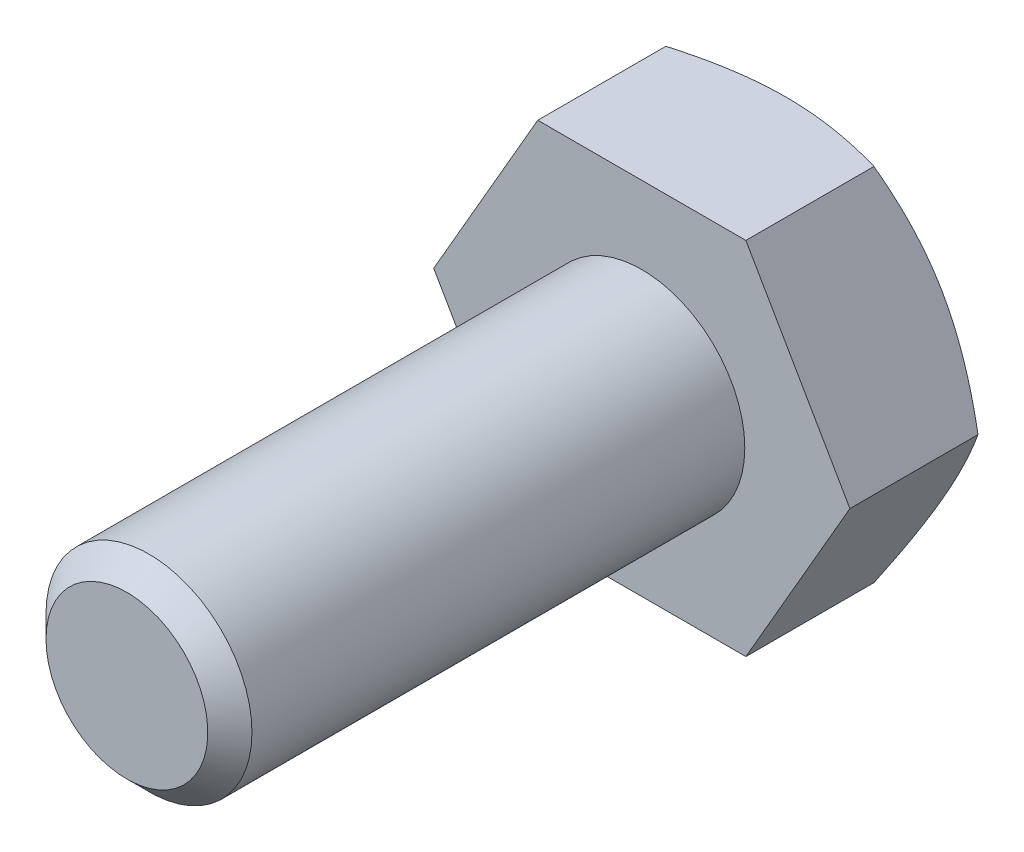
ISO-10303-21;
HEADER;
FILE_DESCRIPTION(('STEP AP214'),'2;1');
FILE_NAME('part.step','',(''),(''),'','','');
FILE_SCHEMA(('AUTOMOTIVE_DESIGN { 1 0 10303 214 1 1 1 1 }'));
ENDSEC;
DATA;
#1=APPLICATION_CONTEXT('core data for automotive mechanical design processes');
#2=APPLICATION_PROTOCOL_DEFINITION('international standard','automotive_design',2000,#1);
#3=PRODUCT_CONTEXT('',#1,'mechanical');
#4=PRODUCT('Part','Part','',(#3));
#5=PRODUCT_RELATED_PRODUCT_CATEGORY('part','',(#4));
#6=PRODUCT_DEFINITION_FORMATION('','',#4);
#7=PRODUCT_DEFINITION_CONTEXT('part definition',#1,'design');
#8=PRODUCT_DEFINITION('design','',#6,#7);
#9=PRODUCT_DEFINITION_SHAPE('','',#8);
#10=(LENGTH_UNIT() NAMED_UNIT(*) SI_UNIT(.MILLI.,.METRE.));
#11=(NAMED_UNIT(*) PLANE_ANGLE_UNIT() SI_UNIT($,.RADIAN.));
#12=(NAMED_UNIT(*) SI_UNIT($,.STERADIAN.) SOLID_ANGLE_UNIT());
#13=UNCERTAINTY_MEASURE_WITH_UNIT(LENGTH_MEASURE(1.E-05),#10,'distance_accuracy_value','');
#14=(GEOMETRIC_REPRESENTATION_CONTEXT(3) GLOBAL_UNCERTAINTY_ASSIGNED_CONTEXT((#13)) GLOBAL_UNIT_ASSIGNED_CONTEXT((#10,
#11,#12)) REPRESENTATION_CONTEXT('',''));
#15=CARTESIAN_POINT('',(0.,0.,0.));
#16=DIRECTION('',(0.,0.,1.));
#17=DIRECTION('',(1.,0.,0.));
#18=AXIS2_PLACEMENT_3D('',#15,#16,#17);
#19=CARTESIAN_POINT('',(2.02072594216369,-3.5,2.8));
#20=DIRECTION('',(-0.866025403784439,0.5,0.));
#21=DIRECTION('',(-0.5,-0.866025403784439,0.));
#22=AXIS2_PLACEMENT_3D('',#19,#20,#21);
#23=PLANE('',#22);
#24=CARTESIAN_POINT('',(4.04156735438122,0.000200000000000556,0.31267406069337));
#25=CARTESIAN_POINT('',(3.9527667384984,-0.153607178452448,0.261385788989978));
#26=CARTESIAN_POINT('',(3.86319960126198,-0.308742010834423,0.214740953816193));
#27=CARTESIAN_POINT('',(3.68251437287562,-0.621698006576781,0.133321875533351));
#28=CARTESIAN_POINT('',(3.59139307116725,-0.779524730787496,0.0985764355845677));
#29=CARTESIAN_POINT('',(3.41027974688034,-1.09322221038013,0.0444900271828465));
#30=CARTESIAN_POINT('',(3.32031559103708,-1.24904469916069,0.0247890862603917));
#31=CARTESIAN_POINT('',(3.13996396008051,-1.56142288720537,0.00127013273726306));
#32=CARTESIAN_POINT('',(3.04957714051106,-1.71797745103423,-0.00256735545442735));
#33=CARTESIAN_POINT('',(2.88068384499777,-2.01050921992099,0.00541530187698509));
#34=CARTESIAN_POINT('',(2.80215208834114,-2.14653021245791,0.0152754340696155));
#35=CARTESIAN_POINT('',(2.64560020969753,-2.41768602028899,0.0465264668994113));
#36=CARTESIAN_POINT('',(2.5675806292065,-2.55281989768468,0.0679280432858044));
#37=CARTESIAN_POINT('',(2.41070596159678,-2.82453479240518,0.12143040788058));
#38=CARTESIAN_POINT('',(2.33187072981464,-2.96108141927833,0.153757994445087));
#39=CARTESIAN_POINT('',(2.17537608630783,-3.2321380929445,0.227128933807991));
#40=CARTESIAN_POINT('',(2.09771466960098,-3.36665161246853,0.268155046569862));
#41=CARTESIAN_POINT('',(2.02061047210985,-3.5002,0.312674060693366));
#42=B_SPLINE_CURVE_WITH_KNOTS('',3,(#24,#25,#26,#27,#28,#29,#30,#31,#32,#33,#34,#35,#36,#37,#38,
#39,#40,#41),.UNSPECIFIED.,.F.,.F.,(4,2,2,2,2,2,2,2,4),(0.,0.554793832886253,1.11092123814984,
1.65328467083219,2.19498204478403,2.6666513085086,3.13875761298267,3.62133612600509,
4.10296698719187),.UNSPECIFIED.);
#43=CARTESIAN_POINT('',(4.04145188432734,0.,0.312607391169621));
#44=VERTEX_POINT('',#43);
#45=CARTESIAN_POINT('',(3.03108891324553,-1.75,0.));
#46=VERTEX_POINT('',#45);
#47=EDGE_CURVE('E132',#44,#46,#42,.T.);
#48=ORIENTED_EDGE('',*,*,#47,.F.);
#49=DIRECTION('',(0.,0.,-1.));
#50=VECTOR('',#49,1.);
#51=CARTESIAN_POINT('',(4.04145188432738,0.,2.8));
#52=LINE('',#51,#50);
#53=CARTESIAN_POINT('',(4.04145188432738,0.,2.8));
#54=VERTEX_POINT('',#53);
#55=EDGE_CURVE('E136',#54,#44,#52,.T.);
#56=ORIENTED_EDGE('',*,*,#55,.F.);
#57=DIRECTION('',(0.5,0.866025403784438,0.));
#58=VECTOR('',#57,1.);
#59=CARTESIAN_POINT('',(2.02072594216369,-3.5,2.8));
#60=LINE('',#59,#58);
#61=CARTESIAN_POINT('',(2.02072594216369,-3.5,2.8));
#62=VERTEX_POINT('',#61);
#63=EDGE_CURVE('E250',#62,#54,#60,.T.);
#64=ORIENTED_EDGE('',*,*,#63,.F.);
#65=DIRECTION('',(0.,0.,-1.));
#66=VECTOR('',#65,1.);
#67=CARTESIAN_POINT('',(2.02072594216369,-3.5,2.8));
#68=LINE('',#67,#66);
#69=CARTESIAN_POINT('',(2.02072594216361,-3.5,0.312607391169622));
#70=VERTEX_POINT('',#69);
#71=EDGE_CURVE('E226',#62,#70,#68,.T.);
#72=ORIENTED_EDGE('',*,*,#71,.T.);
#73=EDGE_CURVE('E189',#46,#70,#42,.T.);
#74=ORIENTED_EDGE('',*,*,#73,.F.);
#75=EDGE_LOOP('',(#48,#56,#64,#72,#74));
#76=FACE_BOUND('',#75,.T.);
#77=ADVANCED_FACE('F40',(#76),#23,.F.);
#78=CARTESIAN_POINT('',(4.04145188432738,0.,2.8));
#79=DIRECTION('',(-0.866025403784438,-0.5,0.));
#80=DIRECTION('',(0.5,-0.866025403784438,0.));
#81=AXIS2_PLACEMENT_3D('',#78,#79,#80);
#82=PLANE('',#81);
#83=CARTESIAN_POINT('',(2.02061047210985,3.5002,0.312674060693371));
#84=CARTESIAN_POINT('',(2.10941108799267,3.34639282154755,0.261385788989981));
#85=CARTESIAN_POINT('',(2.19897822522909,3.19125798916558,0.214740953816193));
#86=CARTESIAN_POINT('',(2.37966345361545,2.87830199342322,0.133321875533346));
#87=CARTESIAN_POINT('',(2.47078475532382,2.7204752692125,0.0985764355845604));
#88=CARTESIAN_POINT('',(2.65189807961073,2.40677778961987,0.0444900271828419));
#89=CARTESIAN_POINT('',(2.74186223545399,2.25095530083931,0.0247890862603924));
#90=CARTESIAN_POINT('',(2.92221386641055,1.93857711279463,0.00127013273726144));
#91=CARTESIAN_POINT('',(3.01260068598001,1.78202254896577,-0.00256735545443642));
#92=CARTESIAN_POINT('',(3.1814939814933,1.48949078007901,0.00541530187697904));
#93=CARTESIAN_POINT('',(3.26002573814993,1.3534697875421,0.0152754340696177));
#94=CARTESIAN_POINT('',(3.41657761679353,1.08231397971101,0.0465264668994189));
#95=CARTESIAN_POINT('',(3.49459719728457,0.94718010231532,0.0679280432858091));
#96=CARTESIAN_POINT('',(3.65147186489429,0.675465207594818,0.12143040788058));
#97=CARTESIAN_POINT('',(3.73030709667644,0.538918580721665,0.153757994445085));
#98=CARTESIAN_POINT('',(3.88680174018324,0.267861907055498,0.227128933807988));
#99=CARTESIAN_POINT('',(3.96446315689009,0.133348387531463,0.26815504656986));
#100=CARTESIAN_POINT('',(4.04156735438122,-0.000199999999999458,0.312674060693366));
#101=B_SPLINE_CURVE_WITH_KNOTS('',3,(#83,#84,#85,#86,#87,#88,#89,#90,#91,#92,#93,#94,#95,#96,
#97,#98,#99,#100),.UNSPECIFIED.,.F.,.F.,(4,2,2,2,2,2,2,2,4),(0.,0.554793832886253,
1.11092123814984,1.65328467083219,2.19498204478403,2.6666513085086,3.13875761298267,
3.62133612600509,4.10296698719187),.UNSPECIFIED.);
#102=CARTESIAN_POINT('',(2.02072594216373,3.49999999999993,0.312607391169621));
#103=VERTEX_POINT('',#102);
#104=CARTESIAN_POINT('',(3.03108891324553,1.75,0.));
#105=VERTEX_POINT('',#104);
#106=EDGE_CURVE('E111',#103,#105,#101,.T.);
#107=ORIENTED_EDGE('',*,*,#106,.F.);
#108=DIRECTION('',(0.,0.,-1.));
#109=VECTOR('',#108,1.);
#110=CARTESIAN_POINT('',(2.02072594216369,3.5,2.8));
#111=LINE('',#110,#109);
#112=CARTESIAN_POINT('',(2.02072594216369,3.5,2.8));
#113=VERTEX_POINT('',#112);
#114=EDGE_CURVE('E235',#113,#103,#111,.T.);
#115=ORIENTED_EDGE('',*,*,#114,.F.);
#116=DIRECTION('',(-0.5,0.866025403784438,0.));
#117=VECTOR('',#116,1.);
#118=CARTESIAN_POINT('',(4.04145188432738,0.,2.8));
#119=LINE('',#118,#117);
#120=EDGE_CURVE('E254',#54,#113,#119,.T.);
#121=ORIENTED_EDGE('',*,*,#120,.F.);
#122=ORIENTED_EDGE('',*,*,#55,.T.);
#123=EDGE_CURVE('E124',#105,#44,#101,.T.);
#124=ORIENTED_EDGE('',*,*,#123,.F.);
#125=EDGE_LOOP('',(#107,#115,#121,#122,#124));
#126=FACE_BOUND('',#125,.T.);
#127=ADVANCED_FACE('F144',(#126),#82,.F.);
#128=CARTESIAN_POINT('',(2.02072594216369,3.5,2.8));
#129=DIRECTION('',(0.,-1.,0.));
#130=DIRECTION('',(1.,0.,0.));
#131=AXIS2_PLACEMENT_3D('',#128,#129,#130);
#132=PLANE('',#131);
#133=CARTESIAN_POINT('',(-5.51155991662166,3.5,1.74876972324081));
#134=CARTESIAN_POINT('',(-5.35795146497442,3.5,1.67392336064348));
#135=CARTESIAN_POINT('',(-5.20399921327066,3.5,1.59977092634845));
#136=CARTESIAN_POINT('',(-4.89522455167778,3.5,1.45324265223557));
#137=CARTESIAN_POINT('',(-4.74040201636207,3.5,1.3808670770114));
#138=CARTESIAN_POINT('',(-4.42894615294238,3.5,1.23793493399993));
#139=CARTESIAN_POINT('',(-4.27230760071021,3.5,1.16738971193148));
#140=CARTESIAN_POINT('',(-3.95781335407224,3.5,1.02907715201445));
#141=CARTESIAN_POINT('',(-3.79995771524289,3.5,0.961309688205789));
#142=CARTESIAN_POINT('',(-3.47741113342678,3.5,0.82704925806826));
#143=CARTESIAN_POINT('',(-3.31266966191409,3.5,0.760677040301392));
#144=CARTESIAN_POINT('',(-2.9812905533435,3.5,0.632756391222601));
#145=CARTESIAN_POINT('',(-2.81465271050396,3.5,0.571208489240969));
#146=CARTESIAN_POINT('',(-2.47950135142084,3.5,0.454490935593626));
#147=CARTESIAN_POINT('',(-2.31099212961239,3.5,0.399309072522241));
#148=CARTESIAN_POINT('',(-1.97155788075463,3.5,0.297038623207362));
#149=CARTESIAN_POINT('',(-1.80063360563483,3.5,0.249947575461079));
#150=CARTESIAN_POINT('',(-1.4572176944235,3.5,0.166312731904447));
#151=CARTESIAN_POINT('',(-1.28474069132431,3.5,0.129709932809734));
#152=CARTESIAN_POINT('',(-0.937557024710312,3.5,0.0690664437906034));
#153=CARTESIAN_POINT('',(-0.762850605780836,3.5,0.0450243877823887));
#154=CARTESIAN_POINT('',(-0.414396255839321,3.5,0.0117307990577643));
#155=CARTESIAN_POINT('',(-0.240667591359059,3.5,0.00228260576824369));
#156=CARTESIAN_POINT('',(0.106974361978118,3.5,-0.00154556657178666));
#157=CARTESIAN_POINT('',(0.280887653519265,3.5,0.00407467653682997));
#158=CARTESIAN_POINT('',(0.573677732069625,3.5,0.0258160056757364));
#159=CARTESIAN_POINT('',(0.692856455403477,3.5,0.038129486522305));
#160=CARTESIAN_POINT('',(0.930390572672186,3.5,0.0691104276210956));
#161=CARTESIAN_POINT('',(1.04874586201749,3.5,0.0877786805228852));
#162=CARTESIAN_POINT('',(1.40238821330867,3.5,0.152339395828355));
#163=CARTESIAN_POINT('',(1.63613518289363,3.5,0.206777964761831));
#164=CARTESIAN_POINT('',(1.98584040996062,3.5,0.301818253779737));
#165=CARTESIAN_POINT('',(2.10359260845123,3.5,0.336200478121239));
#166=CARTESIAN_POINT('',(2.33795453185626,3.5,0.408694226179538));
#167=CARTESIAN_POINT('',(2.45456424794999,3.5,0.446805778664193));
#168=CARTESIAN_POINT('',(2.6866764879922,3.5,0.526133501179599));
#169=CARTESIAN_POINT('',(2.80217931315367,3.5,0.56734879790521));
#170=CARTESIAN_POINT('',(3.03221622488004,3.5,0.652383319257563));
#171=CARTESIAN_POINT('',(3.14675033363067,3.5,0.696202484064569));
#172=CARTESIAN_POINT('',(3.45518824791988,3.5,0.817586420524256));
#173=CARTESIAN_POINT('',(3.6482785865349,3.5,0.897216284270029));
#174=CARTESIAN_POINT('',(4.03246734047176,3.5,1.06116121789353));
#175=CARTESIAN_POINT('',(4.22356553103579,3.5,1.14547680977311));
#176=CARTESIAN_POINT('',(4.60422080385889,3.5,1.31768022516433));
#177=CARTESIAN_POINT('',(4.79377732281038,3.5,1.40556928969842));
#178=CARTESIAN_POINT('',(5.17160543290687,3.5,1.5840729434937));
#179=CARTESIAN_POINT('',(5.35987698423192,3.5,1.67468761675267));
#180=CARTESIAN_POINT('',(5.73567568482786,3.5,1.85818750995007));
#181=CARTESIAN_POINT('',(5.92320119337958,3.5,1.95107608308063));
#182=CARTESIAN_POINT('',(6.2974040162792,3.5,2.13854805180964));
#183=CARTESIAN_POINT('',(6.48408132155386,3.5,2.23313146548459));
#184=CARTESIAN_POINT('',(7.04299370869453,3.5,2.51886265052554));
#185=CARTESIAN_POINT('',(7.41419418882237,3.5,2.71203324279836));
#186=CARTESIAN_POINT('',(8.11545297659333,3.5,3.08131090922903));
#187=CARTESIAN_POINT('',(8.44570240889789,3.5,3.25705680052899));
#188=CARTESIAN_POINT('',(9.10509095555404,3.5,3.6106670817404));
#189=CARTESIAN_POINT('',(9.43422999967599,3.5,3.78853160254257));
#190=CARTESIAN_POINT('',(10.0905480477554,3.5,4.14522643287857));
#191=CARTESIAN_POINT('',(10.4177299197431,3.5,4.32405147354834));
#192=CARTESIAN_POINT('',(11.0714005829853,3.5,4.68290305461306));
#193=CARTESIAN_POINT('',(11.3978894271807,3.5,4.86292949853347));
#194=CARTESIAN_POINT('',(11.7241348746726,3.5,5.04339321876767));
#195=B_SPLINE_CURVE_WITH_KNOTS('',3,(#133,#134,#135,#136,#137,#138,#139,#140,#141,#142,#143,
#144,#145,#146,#147,#148,#149,#150,#151,#152,#153,#154,#155,#156,#157,#158,#159,#160,#161,#162,
#163,#164,#165,#166,#167,#168,#169,#170,#171,#172,#173,#174,#175,#176,#177,#178,#179,#180,#181,
#182,#183,#184,#185,#186,#187,#188,#189,#190,#191,#192,#193,#194),.UNSPECIFIED.,.F.,.F.,(4,2,2,
2,2,2,2,2,2,2,2,2,2,2,2,2,2,2,2,2,2,2,2,2,2,2,2,2,2,2,4),(0.,0.512624455455557,1.02532478887103,
1.54067716699584,2.05600615007007,2.58877526866932,3.12160276180876,3.65339055960881,
4.18501628177852,4.71358975001965,5.24210571958897,5.76343550668357,6.28477297996431,
6.64403977825951,7.00335140539847,7.72232402673615,8.09029790450666,8.45827462103385,
8.82614818350626,9.19401329793225,9.82051720822947,10.4470910530887,11.0738843896344,
11.7006970625238,12.3284975533834,12.9563047441025,14.211635085947,15.33392926628,
16.4562931462709,17.574877685398,18.6933734561263),.UNSPECIFIED.);
#196=CARTESIAN_POINT('',(-2.02072594216373,3.49999999999993,0.312607391169617));
#197=VERTEX_POINT('',#196);
#198=CARTESIAN_POINT('',(0.,3.5,0.));
#199=VERTEX_POINT('',#198);
#200=EDGE_CURVE('E55',#197,#199,#195,.T.);
#201=ORIENTED_EDGE('',*,*,#200,.F.);
#202=DIRECTION('',(0.,0.,-1.));
#203=VECTOR('',#202,1.);
#204=CARTESIAN_POINT('',(-2.02072594216369,3.5,2.8));
#205=LINE('',#204,#203);
#206=CARTESIAN_POINT('',(-2.02072594216369,3.5,2.8));
#207=VERTEX_POINT('',#206);
#208=EDGE_CURVE('E228',#207,#197,#205,.T.);
#209=ORIENTED_EDGE('',*,*,#208,.F.);
#210=DIRECTION('',(-1.,0.,0.));
#211=VECTOR('',#210,1.);
#212=CARTESIAN_POINT('',(2.02072594216369,3.5,2.8));
#213=LINE('',#212,#211);
#214=EDGE_CURVE('E258',#113,#207,#213,.T.);
#215=ORIENTED_EDGE('',*,*,#214,.F.);
#216=ORIENTED_EDGE('',*,*,#114,.T.);
#217=EDGE_CURVE('E118',#199,#103,#195,.T.);
#218=ORIENTED_EDGE('',*,*,#217,.F.);
#219=EDGE_LOOP('',(#201,#209,#215,#216,#218));
#220=FACE_BOUND('',#219,.T.);
#221=ADVANCED_FACE('F199',(#220),#132,.F.);
#222=CARTESIAN_POINT('',(-2.02072594216369,3.5,2.8));
#223=DIRECTION('',(0.866025403784439,-0.5,0.));
#224=DIRECTION('',(0.5,0.866025403784439,0.));
#225=AXIS2_PLACEMENT_3D('',#222,#223,#224);
#226=PLANE('',#225);
#227=CARTESIAN_POINT('',(-4.04156735438122,-0.000199999999999569,0.31267406069337));
#228=CARTESIAN_POINT('',(-3.9527667384984,0.153607178452447,0.261385788989969));
#229=CARTESIAN_POINT('',(-3.86319960126198,0.308742010834422,0.214740953816183));
#230=CARTESIAN_POINT('',(-3.68251437287562,0.621698006576781,0.133321875533344));
#231=CARTESIAN_POINT('',(-3.59139307116725,0.779524730787497,0.0985764355845656));
#232=CARTESIAN_POINT('',(-3.41027974688034,1.09322221038013,0.0444900271828477));
#233=CARTESIAN_POINT('',(-3.32031559103708,1.24904469916069,0.0247890862603918));
#234=CARTESIAN_POINT('',(-3.13996396008051,1.56142288720538,0.00127013273726239));
#235=CARTESIAN_POINT('',(-3.04957714051106,1.71797745103423,-0.00256735545442763));
#236=CARTESIAN_POINT('',(-2.88068384499777,2.01050921992099,0.00541530187698513));
#237=CARTESIAN_POINT('',(-2.80215208834114,2.14653021245791,0.0152754340696155));
#238=CARTESIAN_POINT('',(-2.64560020969753,2.417686020289,0.0465264668994113));
#239=CARTESIAN_POINT('',(-2.5675806292065,2.55281989768468,0.0679280432858044));
#240=CARTESIAN_POINT('',(-2.41070596159678,2.82453479240518,0.12143040788058));
#241=CARTESIAN_POINT('',(-2.33187072981463,2.96108141927834,0.153757994445088));
#242=CARTESIAN_POINT('',(-2.17537608630783,3.2321380929445,0.227128933807992));
#243=CARTESIAN_POINT('',(-2.09771466960098,3.36665161246854,0.268155046569863));
#244=CARTESIAN_POINT('',(-2.02061047210985,3.5002,0.312674060693366));
#245=B_SPLINE_CURVE_WITH_KNOTS('',3,(#227,#228,#229,#230,#231,#232,#233,#234,#235,#236,#237,
#238,#239,#240,#241,#242,#243,#244),.UNSPECIFIED.,.F.,.F.,(4,2,2,2,2,2,2,2,4),(0.,
0.554793832886254,1.11092123814984,1.65328467083219,2.19498204478403,2.6666513085086,
3.13875761298267,3.62133612600509,4.10296698719187),.UNSPECIFIED.);
#246=CARTESIAN_POINT('',(-4.04145188432734,0.,0.312607391169618));
#247=VERTEX_POINT('',#246);
#248=CARTESIAN_POINT('',(-3.03108891324553,1.75,0.));
#249=VERTEX_POINT('',#248);
#250=EDGE_CURVE('E63',#247,#249,#245,.T.);
#251=ORIENTED_EDGE('',*,*,#250,.F.);
#252=DIRECTION('',(0.,0.,-1.));
#253=VECTOR('',#252,1.);
#254=CARTESIAN_POINT('',(-4.04145188432738,0.,2.8));
#255=LINE('',#254,#253);
#256=CARTESIAN_POINT('',(-4.04145188432738,0.,2.8));
#257=VERTEX_POINT('',#256);
#258=EDGE_CURVE('E225',#257,#247,#255,.T.);
#259=ORIENTED_EDGE('',*,*,#258,.F.);
#260=DIRECTION('',(-0.5,-0.866025403784439,0.));
#261=VECTOR('',#260,1.);
#262=CARTESIAN_POINT('',(-2.02072594216369,3.5,2.8));
#263=LINE('',#262,#261);
#264=EDGE_CURVE('E260',#207,#257,#263,.T.);
#265=ORIENTED_EDGE('',*,*,#264,.F.);
#266=ORIENTED_EDGE('',*,*,#208,.T.);
#267=EDGE_CURVE('E123',#249,#197,#245,.T.);
#268=ORIENTED_EDGE('',*,*,#267,.F.);
#269=EDGE_LOOP('',(#251,#259,#265,#266,#268));
#270=FACE_BOUND('',#269,.T.);
#271=ADVANCED_FACE('F244',(#270),#226,.F.);
#272=CARTESIAN_POINT('',(-4.04145188432738,0.,2.8));
#273=DIRECTION('',(0.866025403784438,0.5,0.));
#274=DIRECTION('',(-0.5,0.866025403784439,0.));
#275=AXIS2_PLACEMENT_3D('',#272,#273,#274);
#276=PLANE('',#275);
#277=CARTESIAN_POINT('',(-2.02061047210985,-3.5002,0.312674060693371));
#278=CARTESIAN_POINT('',(-2.10941108799267,-3.34639282154755,0.261385788989981));
#279=CARTESIAN_POINT('',(-2.19897822522909,-3.19125798916558,0.214740953816194));
#280=CARTESIAN_POINT('',(-2.37966345361545,-2.87830199342322,0.133321875533346));
#281=CARTESIAN_POINT('',(-2.47078475532382,-2.7204752692125,0.0985764355845603));
#282=CARTESIAN_POINT('',(-2.65189807961073,-2.40677778961987,0.0444900271828417));
#283=CARTESIAN_POINT('',(-2.74186223545399,-2.25095530083931,0.0247890862603922));
#284=CARTESIAN_POINT('',(-2.92221386641055,-1.93857711279463,0.00127013273726135));
#285=CARTESIAN_POINT('',(-3.01260068598001,-1.78202254896577,-0.00256735545443651));
#286=CARTESIAN_POINT('',(-3.1814939814933,-1.48949078007901,0.00541530187697914));
#287=CARTESIAN_POINT('',(-3.26002573814993,-1.3534697875421,0.015275434069618));
#288=CARTESIAN_POINT('',(-3.41657761679353,-1.08231397971101,0.0465264668994193));
#289=CARTESIAN_POINT('',(-3.49459719728457,-0.947180102315319,0.0679280432858094));
#290=CARTESIAN_POINT('',(-3.65147186489429,-0.675465207594817,0.12143040788058));
#291=CARTESIAN_POINT('',(-3.73030709667644,-0.538918580721664,0.153757994445086));
#292=CARTESIAN_POINT('',(-3.88680174018324,-0.267861907055497,0.227128933807988));
#293=CARTESIAN_POINT('',(-3.96446315689009,-0.133348387531462,0.26815504656986));
#294=CARTESIAN_POINT('',(-4.04156735438122,0.000200000000000739,0.312674060693367));
#295=B_SPLINE_CURVE_WITH_KNOTS('',3,(#277,#278,#279,#280,#281,#282,#283,#284,#285,#286,#287,
#288,#289,#290,#291,#292,#293,#294),.UNSPECIFIED.,.F.,.F.,(4,2,2,2,2,2,2,2,4),(0.,
0.554793832886252,1.11092123814984,1.65328467083219,2.19498204478403,2.6666513085086,
3.13875761298267,3.62133612600509,4.10296698719187),.UNSPECIFIED.);
#296=CARTESIAN_POINT('',(-2.02072594216378,-3.5,0.312607391169503));
#297=VERTEX_POINT('',#296);
#298=CARTESIAN_POINT('',(-3.03108891324553,-1.75,0.));
#299=VERTEX_POINT('',#298);
#300=EDGE_CURVE('E183',#297,#299,#295,.T.);
#301=ORIENTED_EDGE('',*,*,#300,.F.);
#302=DIRECTION('',(0.,0.,-1.));
#303=VECTOR('',#302,1.);
#304=CARTESIAN_POINT('',(-2.02072594216369,-3.5,2.8));
#305=LINE('',#304,#303);
#306=CARTESIAN_POINT('',(-2.02072594216369,-3.5,2.8));
#307=VERTEX_POINT('',#306);
#308=EDGE_CURVE('E219',#307,#297,#305,.T.);
#309=ORIENTED_EDGE('',*,*,#308,.F.);
#310=DIRECTION('',(0.5,-0.866025403784438,0.));
#311=VECTOR('',#310,1.);
#312=CARTESIAN_POINT('',(-4.04145188432738,0.,2.8));
#313=LINE('',#312,#311);
#314=EDGE_CURVE('E262',#257,#307,#313,.T.);
#315=ORIENTED_EDGE('',*,*,#314,.F.);
#316=ORIENTED_EDGE('',*,*,#258,.T.);
#317=EDGE_CURVE('E146',#299,#247,#295,.T.);
#318=ORIENTED_EDGE('',*,*,#317,.F.);
#319=EDGE_LOOP('',(#301,#309,#315,#316,#318));
#320=FACE_BOUND('',#319,.T.);
#321=ADVANCED_FACE('F217',(#320),#276,.F.);
#322=CARTESIAN_POINT('',(-2.02072594216369,-3.5,2.8));
#323=DIRECTION('',(0.,1.,0.));
#324=DIRECTION('',(-1.,0.,0.));
#325=AXIS2_PLACEMENT_3D('',#322,#323,#324);
#326=PLANE('',#325);
#327=CARTESIAN_POINT('',(-5.51155991662166,-3.5,1.74876972324081));
#328=CARTESIAN_POINT('',(-5.35795146497441,-3.5,1.67392336064348));
#329=CARTESIAN_POINT('',(-5.20399921327066,-3.5,1.59977092634846));
#330=CARTESIAN_POINT('',(-4.89522455167778,-3.5,1.45324265223557));
#331=CARTESIAN_POINT('',(-4.74040201636206,-3.5,1.3808670770114));
#332=CARTESIAN_POINT('',(-4.42894615294238,-3.5,1.23793493399993));
#333=CARTESIAN_POINT('',(-4.2723076007102,-3.5,1.16738971193149));
#334=CARTESIAN_POINT('',(-3.95781335407223,-3.5,1.02907715201445));
#335=CARTESIAN_POINT('',(-3.79995771524289,-3.5,0.961309688205786));
#336=CARTESIAN_POINT('',(-3.47741113342678,-3.5,0.827049258068254));
#337=CARTESIAN_POINT('',(-3.31266966191408,-3.5,0.760677040301389));
#338=CARTESIAN_POINT('',(-2.9812905533435,-3.5,0.632756391222601));
#339=CARTESIAN_POINT('',(-2.81465271050396,-3.5,0.571208489240969));
#340=CARTESIAN_POINT('',(-2.47950135142083,-3.5,0.454490935593625));
#341=CARTESIAN_POINT('',(-2.31099212961239,-3.5,0.399309072522239));
#342=CARTESIAN_POINT('',(-1.97155788075463,-3.5,0.297038623207356));
#343=CARTESIAN_POINT('',(-1.80063360563483,-3.5,0.249947575461072));
#344=CARTESIAN_POINT('',(-1.45721769442351,-3.5,0.166312731904439));
#345=CARTESIAN_POINT('',(-1.28474069132431,-3.5,0.129709932809727));
#346=CARTESIAN_POINT('',(-0.937557024710314,-3.5,0.0690664437905976));
#347=CARTESIAN_POINT('',(-0.762850605780839,-3.5,0.0450243877823824));
#348=CARTESIAN_POINT('',(-0.414396255839322,-3.5,0.011730799057763));
#349=CARTESIAN_POINT('',(-0.24066759135906,-3.5,0.00228260576824781));
#350=CARTESIAN_POINT('',(0.106974361978117,-3.5,-0.00154556657177938));
#351=CARTESIAN_POINT('',(0.280887653519265,-3.5,0.00407467653683502));
#352=CARTESIAN_POINT('',(0.573677732069626,-3.5,0.0258160056757323));
#353=CARTESIAN_POINT('',(0.692856455403479,-3.5,0.0381294865222956));
#354=CARTESIAN_POINT('',(0.930390572672188,-3.5,0.0691104276210871));
#355=CARTESIAN_POINT('',(1.04874586201749,-3.5,0.0877786805228827));
#356=CARTESIAN_POINT('',(1.40238821330867,-3.5,0.152339395828363));
#357=CARTESIAN_POINT('',(1.63613518289363,-3.5,0.206777964761833));
#358=CARTESIAN_POINT('',(1.98584040996062,-3.5,0.301818253779737));
#359=CARTESIAN_POINT('',(2.10359260845123,-3.5,0.33620047812124));
#360=CARTESIAN_POINT('',(2.33795453185626,-3.5,0.408694226179539));
#361=CARTESIAN_POINT('',(2.45456424794999,-3.5,0.446805778664194));
#362=CARTESIAN_POINT('',(2.6866764879922,-3.5,0.5261335011796));
#363=CARTESIAN_POINT('',(2.80217931315367,-3.5,0.567348797905211));
#364=CARTESIAN_POINT('',(3.03221622488004,-3.5,0.652383319257564));
#365=CARTESIAN_POINT('',(3.14675033363068,-3.5,0.696202484064569));
#366=CARTESIAN_POINT('',(3.45518824791988,-3.5,0.817586420524256));
#367=CARTESIAN_POINT('',(3.6482785865349,-3.5,0.897216284270029));
#368=CARTESIAN_POINT('',(4.03246734047176,-3.5,1.06116121789353));
#369=CARTESIAN_POINT('',(4.22356553103579,-3.5,1.14547680977311));
#370=CARTESIAN_POINT('',(4.60422080385889,-3.5,1.31768022516433));
#371=CARTESIAN_POINT('',(4.79377732281038,-3.5,1.40556928969842));
#372=CARTESIAN_POINT('',(5.17160543290687,-3.5,1.5840729434937));
#373=CARTESIAN_POINT('',(5.35987698423191,-3.5,1.67468761675268));
#374=CARTESIAN_POINT('',(5.73567568482786,-3.5,1.85818750995007));
#375=CARTESIAN_POINT('',(5.92320119337958,-3.5,1.95107608308062));
#376=CARTESIAN_POINT('',(6.2974040162792,-3.5,2.13854805180964));
#377=CARTESIAN_POINT('',(6.48408132155385,-3.5,2.23313146548459));
#378=CARTESIAN_POINT('',(7.04299370869453,-3.5,2.51886265052555));
#379=CARTESIAN_POINT('',(7.41419418882237,-3.5,2.71203324279835));
#380=CARTESIAN_POINT('',(8.11545297659333,-3.5,3.08131090922902));
#381=CARTESIAN_POINT('',(8.44570240889789,-3.5,3.25705680052898));
#382=CARTESIAN_POINT('',(9.10509095555404,-3.5,3.6106670817404));
#383=CARTESIAN_POINT('',(9.43422999967599,-3.5,3.78853160254256));
#384=CARTESIAN_POINT('',(10.0905480477554,-3.5,4.14522643287857));
#385=CARTESIAN_POINT('',(10.4177299197431,-3.5,4.32405147354833));
#386=CARTESIAN_POINT('',(11.0714005829853,-3.5,4.68290305461306));
#387=CARTESIAN_POINT('',(11.3978894271807,-3.5,4.86292949853347));
#388=CARTESIAN_POINT('',(11.7241348746727,-3.5,5.04339321876767));
#389=B_SPLINE_CURVE_WITH_KNOTS('',3,(#327,#328,#329,#330,#331,#332,#333,#334,#335,#336,#337,
#338,#339,#340,#341,#342,#343,#344,#345,#346,#347,#348,#349,#350,#351,#352,#353,#354,#355,#356,
#357,#358,#359,#360,#361,#362,#363,#364,#365,#366,#367,#368,#369,#370,#371,#372,#373,#374,#375,
#376,#377,#378,#379,#380,#381,#382,#383,#384,#385,#386,#387,#388),.UNSPECIFIED.,.F.,.F.,(4,2,2,
2,2,2,2,2,2,2,2,2,2,2,2,2,2,2,2,2,2,2,2,2,2,2,2,2,2,2,4),(0.,0.512624455455557,1.02532478887103,
1.54067716699584,2.05600615007007,2.58877526866932,3.12160276180876,3.65339055960881,
4.18501628177851,4.71358975001965,5.24210571958897,5.76343550668357,6.28477297996431,
6.64403977825951,7.00335140539847,7.72232402673615,8.09029790450666,8.45827462103385,
8.82614818350626,9.19401329793225,9.82051720822947,10.4470910530887,11.0738843896344,
11.7006970625238,12.3284975533834,12.9563047441025,14.211635085947,15.33392926628,
16.4562931462709,17.574877685398,18.6933734561263),.UNSPECIFIED.);
#390=CARTESIAN_POINT('',(0.,-3.5,0.));
#391=VERTEX_POINT('',#390);
#392=EDGE_CURVE('E203',#70,#391,#389,.F.);
#393=ORIENTED_EDGE('',*,*,#392,.F.);
#394=ORIENTED_EDGE('',*,*,#71,.F.);
#395=DIRECTION('',(1.,0.,0.));
#396=VECTOR('',#395,1.);
#397=CARTESIAN_POINT('',(-2.02072594216369,-3.5,2.8));
#398=LINE('',#397,#396);
#399=EDGE_CURVE('E224',#307,#62,#398,.T.);
#400=ORIENTED_EDGE('',*,*,#399,.F.);
#401=ORIENTED_EDGE('',*,*,#308,.T.);
#402=EDGE_CURVE('E141',#391,#297,#389,.F.);
#403=ORIENTED_EDGE('',*,*,#402,.F.);
#404=EDGE_LOOP('',(#393,#394,#400,#401,#403));
#405=FACE_BOUND('',#404,.T.);
#406=ADVANCED_FACE('F222',(#405),#326,.F.);
#407=CARTESIAN_POINT('',(4.04145188432738,0.,2.8));
#408=DIRECTION('',(0.,0.,1.));
#409=DIRECTION('',(1.,0.,0.));
#410=AXIS2_PLACEMENT_3D('',#407,#408,#409);
#411=PLANE('',#410);
#412=ORIENTED_EDGE('',*,*,#63,.T.);
#413=ORIENTED_EDGE('',*,*,#120,.T.);
#414=ORIENTED_EDGE('',*,*,#214,.T.);
#415=ORIENTED_EDGE('',*,*,#264,.T.);
#416=ORIENTED_EDGE('',*,*,#314,.T.);
#417=ORIENTED_EDGE('',*,*,#399,.T.);
#418=EDGE_LOOP('',(#412,#413,#414,#415,#416,#417));
#419=FACE_BOUND('',#418,.T.);
#420=CARTESIAN_POINT('',(0.,0.,2.8));
#421=DIRECTION('',(0.,0.,1.));
#422=DIRECTION('',(1.,0.,0.));
#423=AXIS2_PLACEMENT_3D('',#420,#421,#422);
#424=CIRCLE('',#423,2.);
#425=CARTESIAN_POINT('',(2.,0.,2.8));
#426=VERTEX_POINT('',#425);
#427=EDGE_CURVE('E248',#426,#426,#424,.T.);
#428=ORIENTED_EDGE('',*,*,#427,.F.);
#429=EDGE_LOOP('',(#428));
#430=FACE_BOUND('',#429,.T.);
#431=ADVANCED_FACE('F264',(#419,#430),#411,.T.);
#432=CARTESIAN_POINT('',(0.,0.,12.8));
#433=DIRECTION('',(0.,0.,-1.));
#434=DIRECTION('',(-1.,0.,0.));
#435=AXIS2_PLACEMENT_3D('',#432,#433,#434);
#436=CYLINDRICAL_SURFACE('',#435,2.);
#437=CARTESIAN_POINT('',(0.,0.,12.371));
#438=DIRECTION('',(0.,0.,1.));
#439=DIRECTION('',(1.,0.,0.));
#440=AXIS2_PLACEMENT_3D('',#437,#438,#439);
#441=CIRCLE('',#440,2.);
#442=CARTESIAN_POINT('',(-2.,0.,12.371));
#443=VERTEX_POINT('',#442);
#444=EDGE_CURVE('E11',#443,#443,#441,.F.);
#445=ORIENTED_EDGE('',*,*,#444,.T.);
#446=EDGE_LOOP('',(#445));
#447=FACE_BOUND('',#446,.T.);
#448=ORIENTED_EDGE('',*,*,#427,.T.);
#449=EDGE_LOOP('',(#448));
#450=FACE_BOUND('',#449,.T.);
#451=ADVANCED_FACE('F282',(#447,#450),#436,.T.);
#452=CARTESIAN_POINT('',(0.,0.,12.8));
#453=DIRECTION('',(0.,0.,1.));
#454=DIRECTION('',(1.,0.,0.));
#455=AXIS2_PLACEMENT_3D('',#452,#453,#454);
#456=PLANE('',#455);
#457=CARTESIAN_POINT('',(0.,0.,12.8));
#458=DIRECTION('',(0.,0.,1.));
#459=DIRECTION('',(1.,0.,0.));
#460=AXIS2_PLACEMENT_3D('',#457,#458,#459);
#461=CIRCLE('',#460,1.571);
#462=CARTESIAN_POINT('',(-1.571,0.,12.8));
#463=VERTEX_POINT('',#462);
#464=EDGE_CURVE('E48',#463,#463,#461,.T.);
#465=ORIENTED_EDGE('',*,*,#464,.T.);
#466=EDGE_LOOP('',(#465));
#467=FACE_BOUND('',#466,.T.);
#468=ADVANCED_FACE('F171',(#467),#456,.T.);
#469=CARTESIAN_POINT('',(0.,0.,57.7350269189618));
#470=DIRECTION('',(0.,0.,1.));
#471=DIRECTION('',(1.,0.,0.));
#472=AXIS2_PLACEMENT_3D('',#469,#470,#471);
#473=CONICAL_SURFACE('',#472,103.5,1.0471975511966);
#474=ORIENTED_EDGE('',*,*,#123,.T.);
#475=ORIENTED_EDGE('',*,*,#47,.T.);
#476=CARTESIAN_POINT('',(0.,0.,0.));
#477=DIRECTION('',(0.,0.,1.));
#478=DIRECTION('',(1.,0.,0.));
#479=AXIS2_PLACEMENT_3D('',#476,#477,#478);
#480=CIRCLE('',#479,3.5);
#481=EDGE_CURVE('E129',#46,#105,#480,.T.);
#482=ORIENTED_EDGE('',*,*,#481,.T.);
#483=EDGE_LOOP('',(#474,#475,#482));
#484=FACE_BOUND('',#483,.T.);
#485=ADVANCED_FACE('F130',(#484),#473,.T.);
#486=ORIENTED_EDGE('',*,*,#73,.T.);
#487=ORIENTED_EDGE('',*,*,#392,.T.);
#488=EDGE_CURVE('E135',#391,#46,#480,.T.);
#489=ORIENTED_EDGE('',*,*,#488,.T.);
#490=EDGE_LOOP('',(#486,#487,#489));
#491=FACE_BOUND('',#490,.T.);
#492=ADVANCED_FACE('F241',(#491),#473,.T.);
#493=ORIENTED_EDGE('',*,*,#300,.T.);
#494=EDGE_CURVE('E212',#299,#391,#480,.T.);
#495=ORIENTED_EDGE('',*,*,#494,.T.);
#496=ORIENTED_EDGE('',*,*,#402,.T.);
#497=EDGE_LOOP('',(#493,#495,#496));
#498=FACE_BOUND('',#497,.T.);
#499=ADVANCED_FACE('F170',(#498),#473,.T.);
#500=ORIENTED_EDGE('',*,*,#250,.T.);
#501=EDGE_CURVE('E240',#249,#299,#480,.T.);
#502=ORIENTED_EDGE('',*,*,#501,.T.);
#503=ORIENTED_EDGE('',*,*,#317,.T.);
#504=EDGE_LOOP('',(#500,#502,#503));
#505=FACE_BOUND('',#504,.T.);
#506=ADVANCED_FACE('F169',(#505),#473,.T.);
#507=ORIENTED_EDGE('',*,*,#200,.T.);
#508=EDGE_CURVE('E138',#199,#249,#480,.T.);
#509=ORIENTED_EDGE('',*,*,#508,.T.);
#510=ORIENTED_EDGE('',*,*,#267,.T.);
#511=EDGE_LOOP('',(#507,#509,#510));
#512=FACE_BOUND('',#511,.T.);
#513=ADVANCED_FACE('F165',(#512),#473,.T.);
#514=ORIENTED_EDGE('',*,*,#217,.T.);
#515=ORIENTED_EDGE('',*,*,#106,.T.);
#516=CARTESIAN_POINT('',(0.,0.,0.));
#517=DIRECTION('',(0.,0.,1.));
#518=DIRECTION('',(1.,0.,0.));
#519=AXIS2_PLACEMENT_3D('',#516,#517,#518);
#520=CIRCLE('',#519,3.5);
#521=EDGE_CURVE('E115',#105,#199,#520,.T.);
#522=ORIENTED_EDGE('',*,*,#521,.T.);
#523=EDGE_LOOP('',(#514,#515,#522));
#524=FACE_BOUND('',#523,.T.);
#525=ADVANCED_FACE('F113',(#524),#473,.T.);
#526=CARTESIAN_POINT('',(4.04145188432738,0.,0.));
#527=DIRECTION('',(0.,0.,1.));
#528=DIRECTION('',(1.,0.,0.));
#529=AXIS2_PLACEMENT_3D('',#526,#527,#528);
#530=PLANE('',#529);
#531=ORIENTED_EDGE('',*,*,#521,.F.);
#532=ORIENTED_EDGE('',*,*,#481,.F.);
#533=ORIENTED_EDGE('',*,*,#488,.F.);
#534=ORIENTED_EDGE('',*,*,#494,.F.);
#535=ORIENTED_EDGE('',*,*,#501,.F.);
#536=ORIENTED_EDGE('',*,*,#508,.F.);
#537=EDGE_LOOP('',(#531,#532,#533,#534,#535,#536));
#538=FACE_BOUND('',#537,.T.);
#539=ADVANCED_FACE('F139',(#538),#530,.F.);
#540=CARTESIAN_POINT('',(0.,0.,12.8));
#541=DIRECTION('',(0.,0.,-1.));
#542=DIRECTION('',(-1.,0.,0.));
#543=AXIS2_PLACEMENT_3D('',#540,#541,#542);
#544=CONICAL_SURFACE('',#543,1.571,0.785398163397446);
#545=CARTESIAN_POINT('',(-2.,0.,12.371));
#546=CARTESIAN_POINT('',(-1.99553125,0.,12.37546875));
#547=CARTESIAN_POINT('',(-1.9910625,0.,12.3799375));
#548=CARTESIAN_POINT('',(-1.982125,0.,12.388875));
#549=CARTESIAN_POINT('',(-1.97765625,0.,12.39334375));
#550=CARTESIAN_POINT('',(-1.96871875,0.,12.40228125));
#551=CARTESIAN_POINT('',(-1.96425,0.,12.40675));
#552=CARTESIAN_POINT('',(-1.9553125,0.,12.4156875));
#553=CARTESIAN_POINT('',(-1.95084375,0.,12.42015625));
#554=CARTESIAN_POINT('',(-1.94190625,0.,12.42909375));
#555=CARTESIAN_POINT('',(-1.9374375,0.,12.4335625));
#556=CARTESIAN_POINT('',(-1.9285,0.,12.4425));
#557=CARTESIAN_POINT('',(-1.92403125,0.,12.44696875));
#558=CARTESIAN_POINT('',(-1.91509375,0.,12.45590625));
#559=CARTESIAN_POINT('',(-1.910625,0.,12.460375));
#560=CARTESIAN_POINT('',(-1.9016875,0.,12.4693125));
#561=CARTESIAN_POINT('',(-1.89721875,0.,12.47378125));
#562=CARTESIAN_POINT('',(-1.88828125,0.,12.48271875));
#563=CARTESIAN_POINT('',(-1.8838125,0.,12.4871875));
#564=CARTESIAN_POINT('',(-1.874875,0.,12.496125));
#565=CARTESIAN_POINT('',(-1.87040625,0.,12.50059375));
#566=CARTESIAN_POINT('',(-1.86146875,0.,12.50953125));
#567=CARTESIAN_POINT('',(-1.857,0.,12.514));
#568=CARTESIAN_POINT('',(-1.8480625,0.,12.5229375));
#569=CARTESIAN_POINT('',(-1.84359375,0.,12.52740625));
#570=CARTESIAN_POINT('',(-1.83465625,0.,12.53634375));
#571=CARTESIAN_POINT('',(-1.8301875,0.,12.5408125));
#572=CARTESIAN_POINT('',(-1.82125,0.,12.54975));
#573=CARTESIAN_POINT('',(-1.81678125,0.,12.55421875));
#574=CARTESIAN_POINT('',(-1.80784375,0.,12.56315625));
#575=CARTESIAN_POINT('',(-1.803375,0.,12.567625));
#576=CARTESIAN_POINT('',(-1.7944375,0.,12.5765625));
#577=CARTESIAN_POINT('',(-1.78996875,0.,12.58103125));
#578=CARTESIAN_POINT('',(-1.78103125,0.,12.58996875));
#579=CARTESIAN_POINT('',(-1.7765625,0.,12.5944375));
#580=CARTESIAN_POINT('',(-1.767625,0.,12.603375));
#581=CARTESIAN_POINT('',(-1.76315625,0.,12.60784375));
#582=CARTESIAN_POINT('',(-1.75421875,0.,12.61678125));
#583=CARTESIAN_POINT('',(-1.74975,0.,12.62125));
#584=CARTESIAN_POINT('',(-1.7408125,0.,12.6301875));
#585=CARTESIAN_POINT('',(-1.73634375,0.,12.63465625));
#586=CARTESIAN_POINT('',(-1.72740625,0.,12.64359375));
#587=CARTESIAN_POINT('',(-1.7229375,0.,12.6480625));
#588=CARTESIAN_POINT('',(-1.714,0.,12.657));
#589=CARTESIAN_POINT('',(-1.70953125,0.,12.66146875));
#590=CARTESIAN_POINT('',(-1.70059375,0.,12.67040625));
#591=CARTESIAN_POINT('',(-1.696125,0.,12.674875));
#592=CARTESIAN_POINT('',(-1.6871875,0.,12.6838125));
#593=CARTESIAN_POINT('',(-1.68271875,0.,12.68828125));
#594=CARTESIAN_POINT('',(-1.67378125,0.,12.69721875));
#595=CARTESIAN_POINT('',(-1.6693125,0.,12.7016875));
#596=CARTESIAN_POINT('',(-1.660375,0.,12.710625));
#597=CARTESIAN_POINT('',(-1.65590625,0.,12.71509375));
#598=CARTESIAN_POINT('',(-1.64696875,0.,12.72403125));
#599=CARTESIAN_POINT('',(-1.6425,0.,12.7285));
#600=CARTESIAN_POINT('',(-1.6335625,0.,12.7374375));
#601=CARTESIAN_POINT('',(-1.62909375,0.,12.74190625));
#602=CARTESIAN_POINT('',(-1.62015625,0.,12.75084375));
#603=CARTESIAN_POINT('',(-1.6156875,0.,12.7553125));
#604=CARTESIAN_POINT('',(-1.60675,0.,12.76425));
#605=CARTESIAN_POINT('',(-1.60228125,0.,12.76871875));
#606=CARTESIAN_POINT('',(-1.59334375,0.,12.77765625));
#607=CARTESIAN_POINT('',(-1.588875,0.,12.782125));
#608=CARTESIAN_POINT('',(-1.5799375,0.,12.7910625));
#609=CARTESIAN_POINT('',(-1.57546875,0.,12.79553125));
#610=CARTESIAN_POINT('',(-1.571,0.,12.8));
#611=B_SPLINE_CURVE_WITH_KNOTS('',3,(#545,#546,#547,#548,#549,#550,#551,#552,#553,#554,#555,
#556,#557,#558,#559,#560,#561,#562,#563,#564,#565,#566,#567,#568,#569,#570,#571,#572,#573,#574,
#575,#576,#577,#578,#579,#580,#581,#582,#583,#584,#585,#586,#587,#588,#589,#590,#591,#592,#593,
#594,#595,#596,#597,#598,#599,#600,#601,#602,#603,#604,#605,#606,#607,#608,#609,#610),
.UNSPECIFIED.,.F.,.F.,(4,2,2,2,2,2,2,2,2,2,2,2,2,2,2,2,2,2,2,2,2,2,2,2,2,2,2,2,2,2,2,2,4),(0.,
0.0189593005705646,0.0379186011411291,0.0568779017116937,0.0758372022822584,0.0947965028528231,
0.113755803423388,0.132715103993951,0.151674404564516,0.17063370513508,0.189593005705645,
0.20855230627621,0.227511606846774,0.246470907417338,0.265430207987903,0.284389508558467,
0.303348809129032,0.322308109699596,0.341267410270161,0.360226710840726,0.379186011411289,
0.398145311981854,0.417104612552418,0.436063913122983,0.455023213693548,0.473982514264112,
0.492941814834676,0.51190111540524,0.530860415975805,0.54981971654637,0.568779017116934,
0.587738317687499,0.606697618258063),.UNSPECIFIED.);
#612=EDGE_CURVE('BSEAM42',#443,#463,#611,.T.);
#613=ORIENTED_EDGE('',*,*,#444,.F.);
#614=ORIENTED_EDGE('',*,*,#464,.F.);
#615=ORIENTED_EDGE('',*,*,#612,.T.);
#616=ORIENTED_EDGE('',*,*,#612,.F.);
#617=EDGE_LOOP('',(#613,#615,#614,#616));
#618=FACE_BOUND('',#617,.T.);
#619=ADVANCED_FACE('F42',(#618),#544,.T.);
#620=CLOSED_SHELL('',(#77,#127,#221,#271,#321,#406,#431,#451,#468,#485,#492,#499,#506,#513,#525,
#539,#619));
#621=MANIFOLD_SOLID_BREP('B2',#620);
#622=ADVANCED_BREP_SHAPE_REPRESENTATION('',(#18,#621),#14);
#623=SHAPE_DEFINITION_REPRESENTATION(#9,#622);
ENDSEC;
END-ISO-10303-21;
